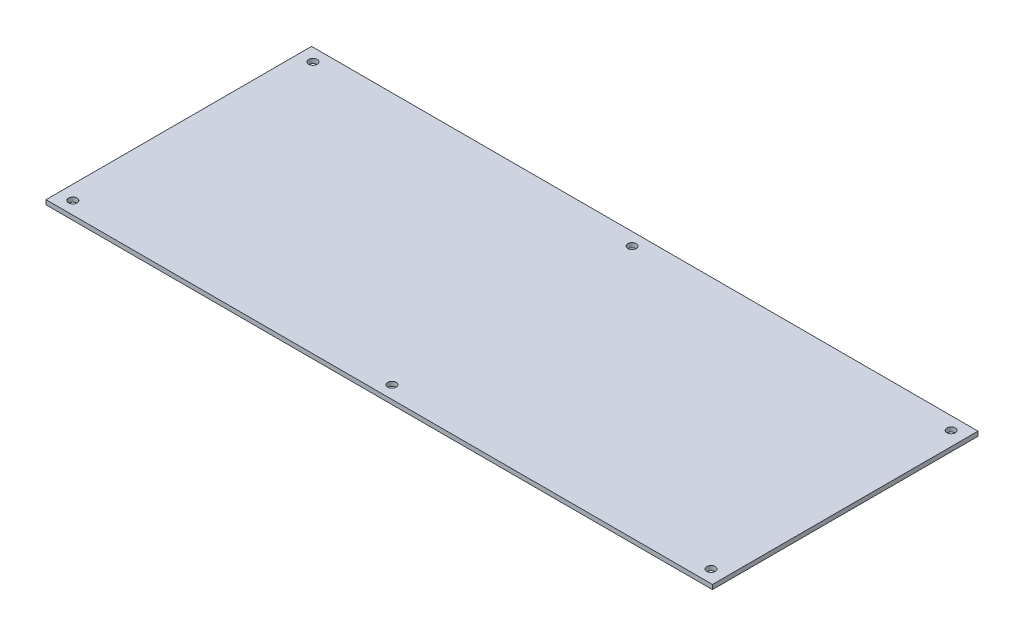
ISO-10303-21;
HEADER;
FILE_DESCRIPTION(('STEP AP214'),'2;1');
FILE_NAME('part.step','',(''),(''),'','','');
FILE_SCHEMA(('AUTOMOTIVE_DESIGN { 1 0 10303 214 1 1 1 1 }'));
ENDSEC;
DATA;
#1=APPLICATION_CONTEXT('core data for automotive mechanical design processes');
#2=APPLICATION_PROTOCOL_DEFINITION('international standard','automotive_design',2000,#1);
#3=PRODUCT_CONTEXT('',#1,'mechanical');
#4=PRODUCT('Part','Part','',(#3));
#5=PRODUCT_RELATED_PRODUCT_CATEGORY('part','',(#4));
#6=PRODUCT_DEFINITION_FORMATION('','',#4);
#7=PRODUCT_DEFINITION_CONTEXT('part definition',#1,'design');
#8=PRODUCT_DEFINITION('design','',#6,#7);
#9=PRODUCT_DEFINITION_SHAPE('','',#8);
#10=(LENGTH_UNIT() NAMED_UNIT(*) SI_UNIT(.MILLI.,.METRE.));
#11=(NAMED_UNIT(*) PLANE_ANGLE_UNIT() SI_UNIT($,.RADIAN.));
#12=(NAMED_UNIT(*) SI_UNIT($,.STERADIAN.) SOLID_ANGLE_UNIT());
#13=UNCERTAINTY_MEASURE_WITH_UNIT(LENGTH_MEASURE(1.E-05),#10,'distance_accuracy_value','');
#14=(GEOMETRIC_REPRESENTATION_CONTEXT(3) GLOBAL_UNCERTAINTY_ASSIGNED_CONTEXT((#13)) GLOBAL_UNIT_ASSIGNED_CONTEXT((#10,
#11,#12)) REPRESENTATION_CONTEXT('',''));
#15=CARTESIAN_POINT('',(0.,0.,0.));
#16=DIRECTION('',(0.,0.,1.));
#17=DIRECTION('',(1.,0.,0.));
#18=AXIS2_PLACEMENT_3D('',#15,#16,#17);
#19=CARTESIAN_POINT('',(235.915,-3.18,94.));
#20=DIRECTION('',(1.,0.,0.));
#21=DIRECTION('',(0.,0.,-1.));
#22=AXIS2_PLACEMENT_3D('',#19,#20,#21);
#23=PLANE('',#22);
#24=DIRECTION('',(0.,0.,-1.));
#25=VECTOR('',#24,1.);
#26=CARTESIAN_POINT('',(235.915,0.,94.));
#27=LINE('',#26,#25);
#28=CARTESIAN_POINT('',(235.915,0.,94.));
#29=VERTEX_POINT('',#28);
#30=CARTESIAN_POINT('',(235.915,0.,-94.));
#31=VERTEX_POINT('',#30);
#32=EDGE_CURVE('E105',#29,#31,#27,.T.);
#33=ORIENTED_EDGE('',*,*,#32,.F.);
#34=DIRECTION('',(0.,1.,0.));
#35=VECTOR('',#34,1.);
#36=CARTESIAN_POINT('',(235.915,-3.18,94.));
#37=LINE('',#36,#35);
#38=CARTESIAN_POINT('',(235.915,-3.18,94.));
#39=VERTEX_POINT('',#38);
#40=EDGE_CURVE('E11',#39,#29,#37,.T.);
#41=ORIENTED_EDGE('',*,*,#40,.F.);
#42=DIRECTION('',(0.,0.,-1.));
#43=VECTOR('',#42,1.);
#44=CARTESIAN_POINT('',(235.915,-3.18,94.));
#45=LINE('',#44,#43);
#46=CARTESIAN_POINT('',(235.915,-3.18,-94.));
#47=VERTEX_POINT('',#46);
#48=EDGE_CURVE('E98',#39,#47,#45,.T.);
#49=ORIENTED_EDGE('',*,*,#48,.T.);
#50=DIRECTION('',(0.,1.,0.));
#51=VECTOR('',#50,1.);
#52=CARTESIAN_POINT('',(235.915,-3.18,-94.));
#53=LINE('',#52,#51);
#54=EDGE_CURVE('E43',#47,#31,#53,.T.);
#55=ORIENTED_EDGE('',*,*,#54,.T.);
#56=EDGE_LOOP('',(#33,#41,#49,#55));
#57=FACE_BOUND('',#56,.T.);
#58=ADVANCED_FACE('F40',(#57),#23,.T.);
#59=CARTESIAN_POINT('',(-235.915,-3.18,94.));
#60=DIRECTION('',(0.,0.,1.));
#61=DIRECTION('',(1.,0.,0.));
#62=AXIS2_PLACEMENT_3D('',#59,#60,#61);
#63=PLANE('',#62);
#64=DIRECTION('',(1.,0.,0.));
#65=VECTOR('',#64,1.);
#66=CARTESIAN_POINT('',(-235.915,0.,94.));
#67=LINE('',#66,#65);
#68=CARTESIAN_POINT('',(-235.915,0.,94.));
#69=VERTEX_POINT('',#68);
#70=EDGE_CURVE('E100',#69,#29,#67,.T.);
#71=ORIENTED_EDGE('',*,*,#70,.F.);
#72=DIRECTION('',(0.,1.,0.));
#73=VECTOR('',#72,1.);
#74=CARTESIAN_POINT('',(-235.915,-3.18,94.));
#75=LINE('',#74,#73);
#76=CARTESIAN_POINT('',(-235.915,-3.18,94.));
#77=VERTEX_POINT('',#76);
#78=EDGE_CURVE('E49',#77,#69,#75,.T.);
#79=ORIENTED_EDGE('',*,*,#78,.F.);
#80=DIRECTION('',(1.,0.,0.));
#81=VECTOR('',#80,1.);
#82=CARTESIAN_POINT('',(-235.915,-3.18,94.));
#83=LINE('',#82,#81);
#84=EDGE_CURVE('E95',#77,#39,#83,.T.);
#85=ORIENTED_EDGE('',*,*,#84,.T.);
#86=ORIENTED_EDGE('',*,*,#40,.T.);
#87=EDGE_LOOP('',(#71,#79,#85,#86));
#88=FACE_BOUND('',#87,.T.);
#89=ADVANCED_FACE('F116',(#88),#63,.T.);
#90=CARTESIAN_POINT('',(-235.915,-3.18,94.));
#91=DIRECTION('',(-1.,0.,0.));
#92=DIRECTION('',(0.,0.,1.));
#93=AXIS2_PLACEMENT_3D('',#90,#91,#92);
#94=PLANE('',#93);
#95=DIRECTION('',(0.,0.,1.));
#96=VECTOR('',#95,1.);
#97=CARTESIAN_POINT('',(-235.915,0.,94.));
#98=LINE('',#97,#96);
#99=CARTESIAN_POINT('',(-235.915,0.,-94.));
#100=VERTEX_POINT('',#99);
#101=EDGE_CURVE('E90',#100,#69,#98,.T.);
#102=ORIENTED_EDGE('',*,*,#101,.F.);
#103=DIRECTION('',(0.,1.,0.));
#104=VECTOR('',#103,1.);
#105=CARTESIAN_POINT('',(-235.915,-3.18,-94.));
#106=LINE('',#105,#104);
#107=CARTESIAN_POINT('',(-235.915,-3.18,-94.));
#108=VERTEX_POINT('',#107);
#109=EDGE_CURVE('E85',#108,#100,#106,.T.);
#110=ORIENTED_EDGE('',*,*,#109,.F.);
#111=DIRECTION('',(0.,0.,1.));
#112=VECTOR('',#111,1.);
#113=CARTESIAN_POINT('',(-235.915,-3.18,94.));
#114=LINE('',#113,#112);
#115=EDGE_CURVE('E88',#108,#77,#114,.T.);
#116=ORIENTED_EDGE('',*,*,#115,.T.);
#117=ORIENTED_EDGE('',*,*,#78,.T.);
#118=EDGE_LOOP('',(#102,#110,#116,#117));
#119=FACE_BOUND('',#118,.T.);
#120=ADVANCED_FACE('F87',(#119),#94,.T.);
#121=CARTESIAN_POINT('',(-235.915,-3.18,-94.));
#122=DIRECTION('',(0.,0.,-1.));
#123=DIRECTION('',(-1.,0.,0.));
#124=AXIS2_PLACEMENT_3D('',#121,#122,#123);
#125=PLANE('',#124);
#126=DIRECTION('',(-1.,0.,0.));
#127=VECTOR('',#126,1.);
#128=CARTESIAN_POINT('',(-235.915,0.,-94.));
#129=LINE('',#128,#127);
#130=EDGE_CURVE('E108',#31,#100,#129,.T.);
#131=ORIENTED_EDGE('',*,*,#130,.F.);
#132=ORIENTED_EDGE('',*,*,#54,.F.);
#133=DIRECTION('',(-1.,0.,0.));
#134=VECTOR('',#133,1.);
#135=CARTESIAN_POINT('',(-235.915,-3.18,-94.));
#136=LINE('',#135,#134);
#137=EDGE_CURVE('E94',#47,#108,#136,.T.);
#138=ORIENTED_EDGE('',*,*,#137,.T.);
#139=ORIENTED_EDGE('',*,*,#109,.T.);
#140=EDGE_LOOP('',(#131,#132,#138,#139));
#141=FACE_BOUND('',#140,.T.);
#142=ADVANCED_FACE('F97',(#141),#125,.T.);
#143=CARTESIAN_POINT('',(0.,-3.18,0.));
#144=DIRECTION('',(0.,-1.,0.));
#145=DIRECTION('',(0.,0.,-1.));
#146=AXIS2_PLACEMENT_3D('',#143,#144,#145);
#147=PLANE('',#146);
#148=CARTESIAN_POINT('',(-225.915,-3.18,-85.));
#149=DIRECTION('',(0.,-1.,0.));
#150=DIRECTION('',(0.,0.,-1.));
#151=AXIS2_PLACEMENT_3D('',#148,#149,#150);
#152=CIRCLE('',#151,2.99999999999999);
#153=CARTESIAN_POINT('',(-225.915,-3.18,-88.));
#154=VERTEX_POINT('',#153);
#155=EDGE_CURVE('E109',#154,#154,#152,.T.);
#156=ORIENTED_EDGE('',*,*,#155,.F.);
#157=EDGE_LOOP('',(#156));
#158=FACE_BOUND('',#157,.T.);
#159=CARTESIAN_POINT('',(225.915,-3.18,-85.));
#160=DIRECTION('',(0.,-1.,0.));
#161=DIRECTION('',(0.,0.,-1.));
#162=AXIS2_PLACEMENT_3D('',#159,#160,#161);
#163=CIRCLE('',#162,2.99999999999999);
#164=CARTESIAN_POINT('',(225.915,-3.18,-88.));
#165=VERTEX_POINT('',#164);
#166=EDGE_CURVE('E198',#165,#165,#163,.T.);
#167=ORIENTED_EDGE('',*,*,#166,.F.);
#168=EDGE_LOOP('',(#167));
#169=FACE_BOUND('',#168,.T.);
#170=CARTESIAN_POINT('',(225.915,-3.18,85.));
#171=DIRECTION('',(0.,-1.,0.));
#172=DIRECTION('',(0.,0.,-1.));
#173=AXIS2_PLACEMENT_3D('',#170,#171,#172);
#174=CIRCLE('',#173,2.99999999999999);
#175=CARTESIAN_POINT('',(225.915,-3.18,82.));
#176=VERTEX_POINT('',#175);
#177=EDGE_CURVE('E195',#176,#176,#174,.T.);
#178=ORIENTED_EDGE('',*,*,#177,.F.);
#179=EDGE_LOOP('',(#178));
#180=FACE_BOUND('',#179,.T.);
#181=CARTESIAN_POINT('',(0.,-3.18,85.));
#182=DIRECTION('',(0.,-1.,0.));
#183=DIRECTION('',(0.,0.,-1.));
#184=AXIS2_PLACEMENT_3D('',#181,#182,#183);
#185=CIRCLE('',#184,3.);
#186=CARTESIAN_POINT('',(0.,-3.18,82.));
#187=VERTEX_POINT('',#186);
#188=EDGE_CURVE('E192',#187,#187,#185,.T.);
#189=ORIENTED_EDGE('',*,*,#188,.F.);
#190=EDGE_LOOP('',(#189));
#191=FACE_BOUND('',#190,.T.);
#192=CARTESIAN_POINT('',(0.,-3.18,-85.));
#193=DIRECTION('',(0.,-1.,0.));
#194=DIRECTION('',(0.,0.,-1.));
#195=AXIS2_PLACEMENT_3D('',#192,#193,#194);
#196=CIRCLE('',#195,3.);
#197=CARTESIAN_POINT('',(0.,-3.18,-88.));
#198=VERTEX_POINT('',#197);
#199=EDGE_CURVE('E166',#198,#198,#196,.T.);
#200=ORIENTED_EDGE('',*,*,#199,.F.);
#201=EDGE_LOOP('',(#200));
#202=FACE_BOUND('',#201,.T.);
#203=CARTESIAN_POINT('',(-225.915,-3.18,85.));
#204=DIRECTION('',(0.,-1.,0.));
#205=DIRECTION('',(0.,0.,-1.));
#206=AXIS2_PLACEMENT_3D('',#203,#204,#205);
#207=CIRCLE('',#206,2.99999999999999);
#208=CARTESIAN_POINT('',(-225.915,-3.18,82.));
#209=VERTEX_POINT('',#208);
#210=EDGE_CURVE('E188',#209,#209,#207,.T.);
#211=ORIENTED_EDGE('',*,*,#210,.F.);
#212=EDGE_LOOP('',(#211));
#213=FACE_BOUND('',#212,.T.);
#214=ORIENTED_EDGE('',*,*,#48,.F.);
#215=ORIENTED_EDGE('',*,*,#84,.F.);
#216=ORIENTED_EDGE('',*,*,#115,.F.);
#217=ORIENTED_EDGE('',*,*,#137,.F.);
#218=EDGE_LOOP('',(#214,#215,#216,#217));
#219=FACE_BOUND('',#218,.T.);
#220=ADVANCED_FACE('F93',(#158,#169,#180,#191,#202,#213,#219),#147,.T.);
#221=CARTESIAN_POINT('',(0.,0.,0.));
#222=DIRECTION('',(0.,-1.,0.));
#223=DIRECTION('',(0.,0.,-1.));
#224=AXIS2_PLACEMENT_3D('',#221,#222,#223);
#225=PLANE('',#224);
#226=CARTESIAN_POINT('',(-225.915,0.,-85.));
#227=DIRECTION('',(0.,-1.,0.));
#228=DIRECTION('',(0.,0.,1.));
#229=AXIS2_PLACEMENT_3D('',#226,#227,#228);
#230=CIRCLE('',#229,2.99999999999999);
#231=CARTESIAN_POINT('',(-225.915,0.,-88.));
#232=VERTEX_POINT('',#231);
#233=EDGE_CURVE('E177',#232,#232,#230,.T.);
#234=ORIENTED_EDGE('',*,*,#233,.T.);
#235=EDGE_LOOP('',(#234));
#236=FACE_BOUND('',#235,.T.);
#237=CARTESIAN_POINT('',(225.915,0.,-85.));
#238=DIRECTION('',(0.,-1.,0.));
#239=DIRECTION('',(0.,0.,-1.));
#240=AXIS2_PLACEMENT_3D('',#237,#238,#239);
#241=CIRCLE('',#240,2.99999999999999);
#242=CARTESIAN_POINT('',(225.915,0.,-88.));
#243=VERTEX_POINT('',#242);
#244=EDGE_CURVE('E181',#243,#243,#241,.T.);
#245=ORIENTED_EDGE('',*,*,#244,.T.);
#246=EDGE_LOOP('',(#245));
#247=FACE_BOUND('',#246,.T.);
#248=CARTESIAN_POINT('',(225.915,0.,85.));
#249=DIRECTION('',(0.,-1.,0.));
#250=DIRECTION('',(0.,0.,1.));
#251=AXIS2_PLACEMENT_3D('',#248,#249,#250);
#252=CIRCLE('',#251,2.99999999999999);
#253=CARTESIAN_POINT('',(225.915,0.,82.));
#254=VERTEX_POINT('',#253);
#255=EDGE_CURVE('E174',#254,#254,#252,.T.);
#256=ORIENTED_EDGE('',*,*,#255,.T.);
#257=EDGE_LOOP('',(#256));
#258=FACE_BOUND('',#257,.T.);
#259=CARTESIAN_POINT('',(0.,0.,85.));
#260=DIRECTION('',(0.,-1.,0.));
#261=DIRECTION('',(0.,0.,-1.));
#262=AXIS2_PLACEMENT_3D('',#259,#260,#261);
#263=CIRCLE('',#262,3.);
#264=CARTESIAN_POINT('',(0.,0.,82.));
#265=VERTEX_POINT('',#264);
#266=EDGE_CURVE('E171',#265,#265,#263,.T.);
#267=ORIENTED_EDGE('',*,*,#266,.T.);
#268=EDGE_LOOP('',(#267));
#269=FACE_BOUND('',#268,.T.);
#270=CARTESIAN_POINT('',(0.,0.,-85.));
#271=DIRECTION('',(0.,-1.,0.));
#272=DIRECTION('',(0.,0.,1.));
#273=AXIS2_PLACEMENT_3D('',#270,#271,#272);
#274=CIRCLE('',#273,3.);
#275=CARTESIAN_POINT('',(0.,0.,-88.));
#276=VERTEX_POINT('',#275);
#277=EDGE_CURVE('E169',#276,#276,#274,.T.);
#278=ORIENTED_EDGE('',*,*,#277,.T.);
#279=EDGE_LOOP('',(#278));
#280=FACE_BOUND('',#279,.T.);
#281=CARTESIAN_POINT('',(-225.915,0.,85.));
#282=DIRECTION('',(0.,-1.,0.));
#283=DIRECTION('',(0.,0.,-1.));
#284=AXIS2_PLACEMENT_3D('',#281,#282,#283);
#285=CIRCLE('',#284,2.99999999999999);
#286=CARTESIAN_POINT('',(-225.915,0.,82.));
#287=VERTEX_POINT('',#286);
#288=EDGE_CURVE('E180',#287,#287,#285,.T.);
#289=ORIENTED_EDGE('',*,*,#288,.T.);
#290=EDGE_LOOP('',(#289));
#291=FACE_BOUND('',#290,.T.);
#292=ORIENTED_EDGE('',*,*,#32,.T.);
#293=ORIENTED_EDGE('',*,*,#130,.T.);
#294=ORIENTED_EDGE('',*,*,#101,.T.);
#295=ORIENTED_EDGE('',*,*,#70,.T.);
#296=EDGE_LOOP('',(#292,#293,#294,#295));
#297=FACE_BOUND('',#296,.T.);
#298=ADVANCED_FACE('F115',(#236,#247,#258,#269,#280,#291,#297),#225,.F.);
#299=CARTESIAN_POINT('',(-225.915,0.,85.));
#300=DIRECTION('',(0.,-1.,0.));
#301=DIRECTION('',(0.,0.,-1.));
#302=AXIS2_PLACEMENT_3D('',#299,#300,#301);
#303=CYLINDRICAL_SURFACE('',#302,2.99999999999999);
#304=CARTESIAN_POINT('',(-225.915,-3.18,82.));
#305=CARTESIAN_POINT('',(-225.915,-3.146875,82.));
#306=CARTESIAN_POINT('',(-225.915,-3.11375,82.));
#307=CARTESIAN_POINT('',(-225.915,-3.0475,82.));
#308=CARTESIAN_POINT('',(-225.915,-3.014375,82.));
#309=CARTESIAN_POINT('',(-225.915,-2.948125,82.));
#310=CARTESIAN_POINT('',(-225.915,-2.915,82.));
#311=CARTESIAN_POINT('',(-225.915,-2.84875,82.));
#312=CARTESIAN_POINT('',(-225.915,-2.815625,82.));
#313=CARTESIAN_POINT('',(-225.915,-2.749375,82.));
#314=CARTESIAN_POINT('',(-225.915,-2.71625,82.));
#315=CARTESIAN_POINT('',(-225.915,-2.65,82.));
#316=CARTESIAN_POINT('',(-225.915,-2.616875,82.));
#317=CARTESIAN_POINT('',(-225.915,-2.550625,82.));
#318=CARTESIAN_POINT('',(-225.915,-2.5175,82.));
#319=CARTESIAN_POINT('',(-225.915,-2.45125,82.));
#320=CARTESIAN_POINT('',(-225.915,-2.418125,82.));
#321=CARTESIAN_POINT('',(-225.915,-2.351875,82.));
#322=CARTESIAN_POINT('',(-225.915,-2.31875,82.));
#323=CARTESIAN_POINT('',(-225.915,-2.2525,82.));
#324=CARTESIAN_POINT('',(-225.915,-2.219375,82.));
#325=CARTESIAN_POINT('',(-225.915,-2.153125,82.));
#326=CARTESIAN_POINT('',(-225.915,-2.12,82.));
#327=CARTESIAN_POINT('',(-225.915,-2.05375,82.));
#328=CARTESIAN_POINT('',(-225.915,-2.020625,82.));
#329=CARTESIAN_POINT('',(-225.915,-1.954375,82.));
#330=CARTESIAN_POINT('',(-225.915,-1.92125,82.));
#331=CARTESIAN_POINT('',(-225.915,-1.855,82.));
#332=CARTESIAN_POINT('',(-225.915,-1.821875,82.));
#333=CARTESIAN_POINT('',(-225.915,-1.755625,82.));
#334=CARTESIAN_POINT('',(-225.915,-1.7225,82.));
#335=CARTESIAN_POINT('',(-225.915,-1.65625,82.));
#336=CARTESIAN_POINT('',(-225.915,-1.623125,82.));
#337=CARTESIAN_POINT('',(-225.915,-1.556875,82.));
#338=CARTESIAN_POINT('',(-225.915,-1.52375,82.));
#339=CARTESIAN_POINT('',(-225.915,-1.4575,82.));
#340=CARTESIAN_POINT('',(-225.915,-1.424375,82.));
#341=CARTESIAN_POINT('',(-225.915,-1.358125,82.));
#342=CARTESIAN_POINT('',(-225.915,-1.325,82.));
#343=CARTESIAN_POINT('',(-225.915,-1.25875,82.));
#344=CARTESIAN_POINT('',(-225.915,-1.225625,82.));
#345=CARTESIAN_POINT('',(-225.915,-1.159375,82.));
#346=CARTESIAN_POINT('',(-225.915,-1.12625,82.));
#347=CARTESIAN_POINT('',(-225.915,-1.06,82.));
#348=CARTESIAN_POINT('',(-225.915,-1.026875,82.));
#349=CARTESIAN_POINT('',(-225.915,-0.960625,82.));
#350=CARTESIAN_POINT('',(-225.915,-0.9275,82.));
#351=CARTESIAN_POINT('',(-225.915,-0.86125,82.));
#352=CARTESIAN_POINT('',(-225.915,-0.828125,82.));
#353=CARTESIAN_POINT('',(-225.915,-0.761875,82.));
#354=CARTESIAN_POINT('',(-225.915,-0.72875,82.));
#355=CARTESIAN_POINT('',(-225.915,-0.6625,82.));
#356=CARTESIAN_POINT('',(-225.915,-0.629375,82.));
#357=CARTESIAN_POINT('',(-225.915,-0.563125,82.));
#358=CARTESIAN_POINT('',(-225.915,-0.53,82.));
#359=CARTESIAN_POINT('',(-225.915,-0.46375,82.));
#360=CARTESIAN_POINT('',(-225.915,-0.430625,82.));
#361=CARTESIAN_POINT('',(-225.915,-0.364375,82.));
#362=CARTESIAN_POINT('',(-225.915,-0.33125,82.));
#363=CARTESIAN_POINT('',(-225.915,-0.265,82.));
#364=CARTESIAN_POINT('',(-225.915,-0.231875,82.));
#365=CARTESIAN_POINT('',(-225.915,-0.165625,82.));
#366=CARTESIAN_POINT('',(-225.915,-0.1325,82.));
#367=CARTESIAN_POINT('',(-225.915,-0.06625,82.));
#368=CARTESIAN_POINT('',(-225.915,-0.033125,82.));
#369=CARTESIAN_POINT('',(-225.915,0.,82.));
#370=B_SPLINE_CURVE_WITH_KNOTS('',3,(#304,#305,#306,#307,#308,#309,#310,#311,#312,#313,#314,
#315,#316,#317,#318,#319,#320,#321,#322,#323,#324,#325,#326,#327,#328,#329,#330,#331,#332,#333,
#334,#335,#336,#337,#338,#339,#340,#341,#342,#343,#344,#345,#346,#347,#348,#349,#350,#351,#352,
#353,#354,#355,#356,#357,#358,#359,#360,#361,#362,#363,#364,#365,#366,#367,#368,#369),
.UNSPECIFIED.,.F.,.F.,(4,2,2,2,2,2,2,2,2,2,2,2,2,2,2,2,2,2,2,2,2,2,2,2,2,2,2,2,2,2,2,2,4),(0.,
0.0993750000000001,0.19875,0.298125,0.3975,0.496875,0.59625,0.695625,0.795,0.894375,0.99375,
1.093125,1.1925,1.291875,1.39125,1.490625,1.59,1.689375,1.78875,1.888125,1.9875,2.086875,
2.18625,2.285625,2.385,2.484375,2.58375,2.683125,2.7825,2.881875,2.98125,3.080625,3.18),.UNSPECIFIED.);
#371=EDGE_CURVE('BSEAM134',#209,#287,#370,.T.);
#372=ORIENTED_EDGE('',*,*,#210,.T.);
#373=ORIENTED_EDGE('',*,*,#288,.F.);
#374=ORIENTED_EDGE('',*,*,#371,.T.);
#375=ORIENTED_EDGE('',*,*,#371,.F.);
#376=EDGE_LOOP('',(#372,#374,#373,#375));
#377=FACE_BOUND('',#376,.T.);
#378=ADVANCED_FACE('F134',(#377),#303,.F.);
#379=CARTESIAN_POINT('',(0.,0.,-85.));
#380=DIRECTION('',(0.,-1.,0.));
#381=DIRECTION('',(0.,0.,-1.));
#382=AXIS2_PLACEMENT_3D('',#379,#380,#381);
#383=CYLINDRICAL_SURFACE('',#382,3.);
#384=CARTESIAN_POINT('',(0.,-3.18,-88.));
#385=CARTESIAN_POINT('',(0.,-3.146875,-88.));
#386=CARTESIAN_POINT('',(0.,-3.11375,-88.));
#387=CARTESIAN_POINT('',(0.,-3.0475,-88.));
#388=CARTESIAN_POINT('',(0.,-3.014375,-88.));
#389=CARTESIAN_POINT('',(0.,-2.948125,-88.));
#390=CARTESIAN_POINT('',(0.,-2.915,-88.));
#391=CARTESIAN_POINT('',(0.,-2.84875,-88.));
#392=CARTESIAN_POINT('',(0.,-2.815625,-88.));
#393=CARTESIAN_POINT('',(0.,-2.749375,-88.));
#394=CARTESIAN_POINT('',(0.,-2.71625,-88.));
#395=CARTESIAN_POINT('',(0.,-2.65,-88.));
#396=CARTESIAN_POINT('',(0.,-2.616875,-88.));
#397=CARTESIAN_POINT('',(0.,-2.550625,-88.));
#398=CARTESIAN_POINT('',(0.,-2.5175,-88.));
#399=CARTESIAN_POINT('',(0.,-2.45125,-88.));
#400=CARTESIAN_POINT('',(0.,-2.418125,-88.));
#401=CARTESIAN_POINT('',(0.,-2.351875,-88.));
#402=CARTESIAN_POINT('',(0.,-2.31875,-88.));
#403=CARTESIAN_POINT('',(0.,-2.2525,-88.));
#404=CARTESIAN_POINT('',(0.,-2.219375,-88.));
#405=CARTESIAN_POINT('',(0.,-2.153125,-88.));
#406=CARTESIAN_POINT('',(0.,-2.12,-88.));
#407=CARTESIAN_POINT('',(0.,-2.05375,-88.));
#408=CARTESIAN_POINT('',(0.,-2.020625,-88.));
#409=CARTESIAN_POINT('',(0.,-1.954375,-88.));
#410=CARTESIAN_POINT('',(0.,-1.92125,-88.));
#411=CARTESIAN_POINT('',(0.,-1.855,-88.));
#412=CARTESIAN_POINT('',(0.,-1.821875,-88.));
#413=CARTESIAN_POINT('',(0.,-1.755625,-88.));
#414=CARTESIAN_POINT('',(0.,-1.7225,-88.));
#415=CARTESIAN_POINT('',(0.,-1.65625,-88.));
#416=CARTESIAN_POINT('',(0.,-1.623125,-88.));
#417=CARTESIAN_POINT('',(0.,-1.556875,-88.));
#418=CARTESIAN_POINT('',(0.,-1.52375,-88.));
#419=CARTESIAN_POINT('',(0.,-1.4575,-88.));
#420=CARTESIAN_POINT('',(0.,-1.424375,-88.));
#421=CARTESIAN_POINT('',(0.,-1.358125,-88.));
#422=CARTESIAN_POINT('',(0.,-1.325,-88.));
#423=CARTESIAN_POINT('',(0.,-1.25875,-88.));
#424=CARTESIAN_POINT('',(0.,-1.225625,-88.));
#425=CARTESIAN_POINT('',(0.,-1.159375,-88.));
#426=CARTESIAN_POINT('',(0.,-1.12625,-88.));
#427=CARTESIAN_POINT('',(0.,-1.06,-88.));
#428=CARTESIAN_POINT('',(0.,-1.026875,-88.));
#429=CARTESIAN_POINT('',(0.,-0.960625,-88.));
#430=CARTESIAN_POINT('',(0.,-0.9275,-88.));
#431=CARTESIAN_POINT('',(0.,-0.86125,-88.));
#432=CARTESIAN_POINT('',(0.,-0.828125,-88.));
#433=CARTESIAN_POINT('',(0.,-0.761875,-88.));
#434=CARTESIAN_POINT('',(0.,-0.72875,-88.));
#435=CARTESIAN_POINT('',(0.,-0.6625,-88.));
#436=CARTESIAN_POINT('',(0.,-0.629375,-88.));
#437=CARTESIAN_POINT('',(0.,-0.563125,-88.));
#438=CARTESIAN_POINT('',(0.,-0.53,-88.));
#439=CARTESIAN_POINT('',(0.,-0.46375,-88.));
#440=CARTESIAN_POINT('',(0.,-0.430625,-88.));
#441=CARTESIAN_POINT('',(0.,-0.364375,-88.));
#442=CARTESIAN_POINT('',(0.,-0.33125,-88.));
#443=CARTESIAN_POINT('',(0.,-0.265,-88.));
#444=CARTESIAN_POINT('',(0.,-0.231875,-88.));
#445=CARTESIAN_POINT('',(0.,-0.165625,-88.));
#446=CARTESIAN_POINT('',(0.,-0.1325,-88.));
#447=CARTESIAN_POINT('',(0.,-0.06625,-88.));
#448=CARTESIAN_POINT('',(0.,-0.033125,-88.));
#449=CARTESIAN_POINT('',(0.,0.,-88.));
#450=B_SPLINE_CURVE_WITH_KNOTS('',3,(#384,#385,#386,#387,#388,#389,#390,#391,#392,#393,#394,
#395,#396,#397,#398,#399,#400,#401,#402,#403,#404,#405,#406,#407,#408,#409,#410,#411,#412,#413,
#414,#415,#416,#417,#418,#419,#420,#421,#422,#423,#424,#425,#426,#427,#428,#429,#430,#431,#432,
#433,#434,#435,#436,#437,#438,#439,#440,#441,#442,#443,#444,#445,#446,#447,#448,#449),
.UNSPECIFIED.,.F.,.F.,(4,2,2,2,2,2,2,2,2,2,2,2,2,2,2,2,2,2,2,2,2,2,2,2,2,2,2,2,2,2,2,2,4),(0.,
0.0993750000000001,0.19875,0.298125,0.3975,0.496875,0.59625,0.695625,0.795,0.894375,0.99375,
1.093125,1.1925,1.291875,1.39125,1.490625,1.59,1.689375,1.78875,1.888125,1.9875,2.086875,
2.18625,2.285625,2.385,2.484375,2.58375,2.683125,2.7825,2.881875,2.98125,3.080625,3.18),.UNSPECIFIED.);
#451=EDGE_CURVE('BSEAM141',#198,#276,#450,.T.);
#452=ORIENTED_EDGE('',*,*,#199,.T.);
#453=ORIENTED_EDGE('',*,*,#277,.F.);
#454=ORIENTED_EDGE('',*,*,#451,.T.);
#455=ORIENTED_EDGE('',*,*,#451,.F.);
#456=EDGE_LOOP('',(#452,#454,#453,#455));
#457=FACE_BOUND('',#456,.T.);
#458=ADVANCED_FACE('F141',(#457),#383,.F.);
#459=CARTESIAN_POINT('',(0.,0.,85.));
#460=DIRECTION('',(0.,-1.,0.));
#461=DIRECTION('',(0.,0.,-1.));
#462=AXIS2_PLACEMENT_3D('',#459,#460,#461);
#463=CYLINDRICAL_SURFACE('',#462,3.);
#464=CARTESIAN_POINT('',(0.,-3.18,82.));
#465=CARTESIAN_POINT('',(0.,-3.146875,82.));
#466=CARTESIAN_POINT('',(0.,-3.11375,82.));
#467=CARTESIAN_POINT('',(0.,-3.0475,82.));
#468=CARTESIAN_POINT('',(0.,-3.014375,82.));
#469=CARTESIAN_POINT('',(0.,-2.948125,82.));
#470=CARTESIAN_POINT('',(0.,-2.915,82.));
#471=CARTESIAN_POINT('',(0.,-2.84875,82.));
#472=CARTESIAN_POINT('',(0.,-2.815625,82.));
#473=CARTESIAN_POINT('',(0.,-2.749375,82.));
#474=CARTESIAN_POINT('',(0.,-2.71625,82.));
#475=CARTESIAN_POINT('',(0.,-2.65,82.));
#476=CARTESIAN_POINT('',(0.,-2.616875,82.));
#477=CARTESIAN_POINT('',(0.,-2.550625,82.));
#478=CARTESIAN_POINT('',(0.,-2.5175,82.));
#479=CARTESIAN_POINT('',(0.,-2.45125,82.));
#480=CARTESIAN_POINT('',(0.,-2.418125,82.));
#481=CARTESIAN_POINT('',(0.,-2.351875,82.));
#482=CARTESIAN_POINT('',(0.,-2.31875,82.));
#483=CARTESIAN_POINT('',(0.,-2.2525,82.));
#484=CARTESIAN_POINT('',(0.,-2.219375,82.));
#485=CARTESIAN_POINT('',(0.,-2.153125,82.));
#486=CARTESIAN_POINT('',(0.,-2.12,82.));
#487=CARTESIAN_POINT('',(0.,-2.05375,82.));
#488=CARTESIAN_POINT('',(0.,-2.020625,82.));
#489=CARTESIAN_POINT('',(0.,-1.954375,82.));
#490=CARTESIAN_POINT('',(0.,-1.92125,82.));
#491=CARTESIAN_POINT('',(0.,-1.855,82.));
#492=CARTESIAN_POINT('',(0.,-1.821875,82.));
#493=CARTESIAN_POINT('',(0.,-1.755625,82.));
#494=CARTESIAN_POINT('',(0.,-1.7225,82.));
#495=CARTESIAN_POINT('',(0.,-1.65625,82.));
#496=CARTESIAN_POINT('',(0.,-1.623125,82.));
#497=CARTESIAN_POINT('',(0.,-1.556875,82.));
#498=CARTESIAN_POINT('',(0.,-1.52375,82.));
#499=CARTESIAN_POINT('',(0.,-1.4575,82.));
#500=CARTESIAN_POINT('',(0.,-1.424375,82.));
#501=CARTESIAN_POINT('',(0.,-1.358125,82.));
#502=CARTESIAN_POINT('',(0.,-1.325,82.));
#503=CARTESIAN_POINT('',(0.,-1.25875,82.));
#504=CARTESIAN_POINT('',(0.,-1.225625,82.));
#505=CARTESIAN_POINT('',(0.,-1.159375,82.));
#506=CARTESIAN_POINT('',(0.,-1.12625,82.));
#507=CARTESIAN_POINT('',(0.,-1.06,82.));
#508=CARTESIAN_POINT('',(0.,-1.026875,82.));
#509=CARTESIAN_POINT('',(0.,-0.960625,82.));
#510=CARTESIAN_POINT('',(0.,-0.9275,82.));
#511=CARTESIAN_POINT('',(0.,-0.86125,82.));
#512=CARTESIAN_POINT('',(0.,-0.828125,82.));
#513=CARTESIAN_POINT('',(0.,-0.761875,82.));
#514=CARTESIAN_POINT('',(0.,-0.72875,82.));
#515=CARTESIAN_POINT('',(0.,-0.6625,82.));
#516=CARTESIAN_POINT('',(0.,-0.629375,82.));
#517=CARTESIAN_POINT('',(0.,-0.563125,82.));
#518=CARTESIAN_POINT('',(0.,-0.53,82.));
#519=CARTESIAN_POINT('',(0.,-0.46375,82.));
#520=CARTESIAN_POINT('',(0.,-0.430625,82.));
#521=CARTESIAN_POINT('',(0.,-0.364375,82.));
#522=CARTESIAN_POINT('',(0.,-0.33125,82.));
#523=CARTESIAN_POINT('',(0.,-0.265,82.));
#524=CARTESIAN_POINT('',(0.,-0.231875,82.));
#525=CARTESIAN_POINT('',(0.,-0.165625,82.));
#526=CARTESIAN_POINT('',(0.,-0.1325,82.));
#527=CARTESIAN_POINT('',(0.,-0.06625,82.));
#528=CARTESIAN_POINT('',(0.,-0.033125,82.));
#529=CARTESIAN_POINT('',(0.,0.,82.));
#530=B_SPLINE_CURVE_WITH_KNOTS('',3,(#464,#465,#466,#467,#468,#469,#470,#471,#472,#473,#474,
#475,#476,#477,#478,#479,#480,#481,#482,#483,#484,#485,#486,#487,#488,#489,#490,#491,#492,#493,
#494,#495,#496,#497,#498,#499,#500,#501,#502,#503,#504,#505,#506,#507,#508,#509,#510,#511,#512,
#513,#514,#515,#516,#517,#518,#519,#520,#521,#522,#523,#524,#525,#526,#527,#528,#529),
.UNSPECIFIED.,.F.,.F.,(4,2,2,2,2,2,2,2,2,2,2,2,2,2,2,2,2,2,2,2,2,2,2,2,2,2,2,2,2,2,2,2,4),(0.,
0.0993750000000001,0.19875,0.298125,0.3975,0.496875,0.59625,0.695625,0.795,0.894375,0.99375,
1.093125,1.1925,1.291875,1.39125,1.490625,1.59,1.689375,1.78875,1.888125,1.9875,2.086875,
2.18625,2.285625,2.385,2.484375,2.58375,2.683125,2.7825,2.881875,2.98125,3.080625,3.18),.UNSPECIFIED.);
#531=EDGE_CURVE('BSEAM143',#187,#265,#530,.T.);
#532=ORIENTED_EDGE('',*,*,#188,.T.);
#533=ORIENTED_EDGE('',*,*,#266,.F.);
#534=ORIENTED_EDGE('',*,*,#531,.T.);
#535=ORIENTED_EDGE('',*,*,#531,.F.);
#536=EDGE_LOOP('',(#532,#534,#533,#535));
#537=FACE_BOUND('',#536,.T.);
#538=ADVANCED_FACE('F143',(#537),#463,.F.);
#539=CARTESIAN_POINT('',(225.915,0.,85.));
#540=DIRECTION('',(0.,-1.,0.));
#541=DIRECTION('',(0.,0.,-1.));
#542=AXIS2_PLACEMENT_3D('',#539,#540,#541);
#543=CYLINDRICAL_SURFACE('',#542,2.99999999999999);
#544=CARTESIAN_POINT('',(225.915,-3.18,82.));
#545=CARTESIAN_POINT('',(225.915,-3.146875,82.));
#546=CARTESIAN_POINT('',(225.915,-3.11375,82.));
#547=CARTESIAN_POINT('',(225.915,-3.0475,82.));
#548=CARTESIAN_POINT('',(225.915,-3.014375,82.));
#549=CARTESIAN_POINT('',(225.915,-2.948125,82.));
#550=CARTESIAN_POINT('',(225.915,-2.915,82.));
#551=CARTESIAN_POINT('',(225.915,-2.84875,82.));
#552=CARTESIAN_POINT('',(225.915,-2.815625,82.));
#553=CARTESIAN_POINT('',(225.915,-2.749375,82.));
#554=CARTESIAN_POINT('',(225.915,-2.71625,82.));
#555=CARTESIAN_POINT('',(225.915,-2.65,82.));
#556=CARTESIAN_POINT('',(225.915,-2.616875,82.));
#557=CARTESIAN_POINT('',(225.915,-2.550625,82.));
#558=CARTESIAN_POINT('',(225.915,-2.5175,82.));
#559=CARTESIAN_POINT('',(225.915,-2.45125,82.));
#560=CARTESIAN_POINT('',(225.915,-2.418125,82.));
#561=CARTESIAN_POINT('',(225.915,-2.351875,82.));
#562=CARTESIAN_POINT('',(225.915,-2.31875,82.));
#563=CARTESIAN_POINT('',(225.915,-2.2525,82.));
#564=CARTESIAN_POINT('',(225.915,-2.219375,82.));
#565=CARTESIAN_POINT('',(225.915,-2.153125,82.));
#566=CARTESIAN_POINT('',(225.915,-2.12,82.));
#567=CARTESIAN_POINT('',(225.915,-2.05375,82.));
#568=CARTESIAN_POINT('',(225.915,-2.020625,82.));
#569=CARTESIAN_POINT('',(225.915,-1.954375,82.));
#570=CARTESIAN_POINT('',(225.915,-1.92125,82.));
#571=CARTESIAN_POINT('',(225.915,-1.855,82.));
#572=CARTESIAN_POINT('',(225.915,-1.821875,82.));
#573=CARTESIAN_POINT('',(225.915,-1.755625,82.));
#574=CARTESIAN_POINT('',(225.915,-1.7225,82.));
#575=CARTESIAN_POINT('',(225.915,-1.65625,82.));
#576=CARTESIAN_POINT('',(225.915,-1.623125,82.));
#577=CARTESIAN_POINT('',(225.915,-1.556875,82.));
#578=CARTESIAN_POINT('',(225.915,-1.52375,82.));
#579=CARTESIAN_POINT('',(225.915,-1.4575,82.));
#580=CARTESIAN_POINT('',(225.915,-1.424375,82.));
#581=CARTESIAN_POINT('',(225.915,-1.358125,82.));
#582=CARTESIAN_POINT('',(225.915,-1.325,82.));
#583=CARTESIAN_POINT('',(225.915,-1.25875,82.));
#584=CARTESIAN_POINT('',(225.915,-1.225625,82.));
#585=CARTESIAN_POINT('',(225.915,-1.159375,82.));
#586=CARTESIAN_POINT('',(225.915,-1.12625,82.));
#587=CARTESIAN_POINT('',(225.915,-1.06,82.));
#588=CARTESIAN_POINT('',(225.915,-1.026875,82.));
#589=CARTESIAN_POINT('',(225.915,-0.960625,82.));
#590=CARTESIAN_POINT('',(225.915,-0.9275,82.));
#591=CARTESIAN_POINT('',(225.915,-0.86125,82.));
#592=CARTESIAN_POINT('',(225.915,-0.828125,82.));
#593=CARTESIAN_POINT('',(225.915,-0.761875,82.));
#594=CARTESIAN_POINT('',(225.915,-0.72875,82.));
#595=CARTESIAN_POINT('',(225.915,-0.6625,82.));
#596=CARTESIAN_POINT('',(225.915,-0.629375,82.));
#597=CARTESIAN_POINT('',(225.915,-0.563125,82.));
#598=CARTESIAN_POINT('',(225.915,-0.53,82.));
#599=CARTESIAN_POINT('',(225.915,-0.46375,82.));
#600=CARTESIAN_POINT('',(225.915,-0.430625,82.));
#601=CARTESIAN_POINT('',(225.915,-0.364375,82.));
#602=CARTESIAN_POINT('',(225.915,-0.33125,82.));
#603=CARTESIAN_POINT('',(225.915,-0.265,82.));
#604=CARTESIAN_POINT('',(225.915,-0.231875,82.));
#605=CARTESIAN_POINT('',(225.915,-0.165625,82.));
#606=CARTESIAN_POINT('',(225.915,-0.1325,82.));
#607=CARTESIAN_POINT('',(225.915,-0.06625,82.));
#608=CARTESIAN_POINT('',(225.915,-0.033125,82.));
#609=CARTESIAN_POINT('',(225.915,0.,82.));
#610=B_SPLINE_CURVE_WITH_KNOTS('',3,(#544,#545,#546,#547,#548,#549,#550,#551,#552,#553,#554,
#555,#556,#557,#558,#559,#560,#561,#562,#563,#564,#565,#566,#567,#568,#569,#570,#571,#572,#573,
#574,#575,#576,#577,#578,#579,#580,#581,#582,#583,#584,#585,#586,#587,#588,#589,#590,#591,#592,
#593,#594,#595,#596,#597,#598,#599,#600,#601,#602,#603,#604,#605,#606,#607,#608,#609),
.UNSPECIFIED.,.F.,.F.,(4,2,2,2,2,2,2,2,2,2,2,2,2,2,2,2,2,2,2,2,2,2,2,2,2,2,2,2,2,2,2,2,4),(0.,
0.0993750000000001,0.19875,0.298125,0.3975,0.496875,0.59625,0.695625,0.795,0.894375,0.99375,
1.093125,1.1925,1.291875,1.39125,1.490625,1.59,1.689375,1.78875,1.888125,1.9875,2.086875,
2.18625,2.285625,2.385,2.484375,2.58375,2.683125,2.7825,2.881875,2.98125,3.080625,3.18),.UNSPECIFIED.);
#611=EDGE_CURVE('BSEAM146',#176,#254,#610,.T.);
#612=ORIENTED_EDGE('',*,*,#177,.T.);
#613=ORIENTED_EDGE('',*,*,#255,.F.);
#614=ORIENTED_EDGE('',*,*,#611,.T.);
#615=ORIENTED_EDGE('',*,*,#611,.F.);
#616=EDGE_LOOP('',(#612,#614,#613,#615));
#617=FACE_BOUND('',#616,.T.);
#618=ADVANCED_FACE('F146',(#617),#543,.F.);
#619=CARTESIAN_POINT('',(225.915,0.,-85.));
#620=DIRECTION('',(0.,-1.,0.));
#621=DIRECTION('',(0.,0.,-1.));
#622=AXIS2_PLACEMENT_3D('',#619,#620,#621);
#623=CYLINDRICAL_SURFACE('',#622,2.99999999999999);
#624=CARTESIAN_POINT('',(225.915,-3.18,-88.));
#625=CARTESIAN_POINT('',(225.915,-3.146875,-88.));
#626=CARTESIAN_POINT('',(225.915,-3.11375,-88.));
#627=CARTESIAN_POINT('',(225.915,-3.0475,-88.));
#628=CARTESIAN_POINT('',(225.915,-3.014375,-88.));
#629=CARTESIAN_POINT('',(225.915,-2.948125,-88.));
#630=CARTESIAN_POINT('',(225.915,-2.915,-88.));
#631=CARTESIAN_POINT('',(225.915,-2.84875,-88.));
#632=CARTESIAN_POINT('',(225.915,-2.815625,-88.));
#633=CARTESIAN_POINT('',(225.915,-2.749375,-88.));
#634=CARTESIAN_POINT('',(225.915,-2.71625,-88.));
#635=CARTESIAN_POINT('',(225.915,-2.65,-88.));
#636=CARTESIAN_POINT('',(225.915,-2.616875,-88.));
#637=CARTESIAN_POINT('',(225.915,-2.550625,-88.));
#638=CARTESIAN_POINT('',(225.915,-2.5175,-88.));
#639=CARTESIAN_POINT('',(225.915,-2.45125,-88.));
#640=CARTESIAN_POINT('',(225.915,-2.418125,-88.));
#641=CARTESIAN_POINT('',(225.915,-2.351875,-88.));
#642=CARTESIAN_POINT('',(225.915,-2.31875,-88.));
#643=CARTESIAN_POINT('',(225.915,-2.2525,-88.));
#644=CARTESIAN_POINT('',(225.915,-2.219375,-88.));
#645=CARTESIAN_POINT('',(225.915,-2.153125,-88.));
#646=CARTESIAN_POINT('',(225.915,-2.12,-88.));
#647=CARTESIAN_POINT('',(225.915,-2.05375,-88.));
#648=CARTESIAN_POINT('',(225.915,-2.020625,-88.));
#649=CARTESIAN_POINT('',(225.915,-1.954375,-88.));
#650=CARTESIAN_POINT('',(225.915,-1.92125,-88.));
#651=CARTESIAN_POINT('',(225.915,-1.855,-88.));
#652=CARTESIAN_POINT('',(225.915,-1.821875,-88.));
#653=CARTESIAN_POINT('',(225.915,-1.755625,-88.));
#654=CARTESIAN_POINT('',(225.915,-1.7225,-88.));
#655=CARTESIAN_POINT('',(225.915,-1.65625,-88.));
#656=CARTESIAN_POINT('',(225.915,-1.623125,-88.));
#657=CARTESIAN_POINT('',(225.915,-1.556875,-88.));
#658=CARTESIAN_POINT('',(225.915,-1.52375,-88.));
#659=CARTESIAN_POINT('',(225.915,-1.4575,-88.));
#660=CARTESIAN_POINT('',(225.915,-1.424375,-88.));
#661=CARTESIAN_POINT('',(225.915,-1.358125,-88.));
#662=CARTESIAN_POINT('',(225.915,-1.325,-88.));
#663=CARTESIAN_POINT('',(225.915,-1.25875,-88.));
#664=CARTESIAN_POINT('',(225.915,-1.225625,-88.));
#665=CARTESIAN_POINT('',(225.915,-1.159375,-88.));
#666=CARTESIAN_POINT('',(225.915,-1.12625,-88.));
#667=CARTESIAN_POINT('',(225.915,-1.06,-88.));
#668=CARTESIAN_POINT('',(225.915,-1.026875,-88.));
#669=CARTESIAN_POINT('',(225.915,-0.960625,-88.));
#670=CARTESIAN_POINT('',(225.915,-0.9275,-88.));
#671=CARTESIAN_POINT('',(225.915,-0.86125,-88.));
#672=CARTESIAN_POINT('',(225.915,-0.828125,-88.));
#673=CARTESIAN_POINT('',(225.915,-0.761875,-88.));
#674=CARTESIAN_POINT('',(225.915,-0.72875,-88.));
#675=CARTESIAN_POINT('',(225.915,-0.6625,-88.));
#676=CARTESIAN_POINT('',(225.915,-0.629375,-88.));
#677=CARTESIAN_POINT('',(225.915,-0.563125,-88.));
#678=CARTESIAN_POINT('',(225.915,-0.53,-88.));
#679=CARTESIAN_POINT('',(225.915,-0.46375,-88.));
#680=CARTESIAN_POINT('',(225.915,-0.430625,-88.));
#681=CARTESIAN_POINT('',(225.915,-0.364375,-88.));
#682=CARTESIAN_POINT('',(225.915,-0.33125,-88.));
#683=CARTESIAN_POINT('',(225.915,-0.265,-88.));
#684=CARTESIAN_POINT('',(225.915,-0.231875,-88.));
#685=CARTESIAN_POINT('',(225.915,-0.165625,-88.));
#686=CARTESIAN_POINT('',(225.915,-0.1325,-88.));
#687=CARTESIAN_POINT('',(225.915,-0.06625,-88.));
#688=CARTESIAN_POINT('',(225.915,-0.033125,-88.));
#689=CARTESIAN_POINT('',(225.915,0.,-88.));
#690=B_SPLINE_CURVE_WITH_KNOTS('',3,(#624,#625,#626,#627,#628,#629,#630,#631,#632,#633,#634,
#635,#636,#637,#638,#639,#640,#641,#642,#643,#644,#645,#646,#647,#648,#649,#650,#651,#652,#653,
#654,#655,#656,#657,#658,#659,#660,#661,#662,#663,#664,#665,#666,#667,#668,#669,#670,#671,#672,
#673,#674,#675,#676,#677,#678,#679,#680,#681,#682,#683,#684,#685,#686,#687,#688,#689),
.UNSPECIFIED.,.F.,.F.,(4,2,2,2,2,2,2,2,2,2,2,2,2,2,2,2,2,2,2,2,2,2,2,2,2,2,2,2,2,2,2,2,4),(0.,
0.0993750000000001,0.19875,0.298125,0.3975,0.496875,0.59625,0.695625,0.795,0.894375,0.99375,
1.093125,1.1925,1.291875,1.39125,1.490625,1.59,1.689375,1.78875,1.888125,1.9875,2.086875,
2.18625,2.285625,2.385,2.484375,2.58375,2.683125,2.7825,2.881875,2.98125,3.080625,3.18),.UNSPECIFIED.);
#691=EDGE_CURVE('BSEAM150',#165,#243,#690,.T.);
#692=ORIENTED_EDGE('',*,*,#166,.T.);
#693=ORIENTED_EDGE('',*,*,#244,.F.);
#694=ORIENTED_EDGE('',*,*,#691,.T.);
#695=ORIENTED_EDGE('',*,*,#691,.F.);
#696=EDGE_LOOP('',(#692,#694,#693,#695));
#697=FACE_BOUND('',#696,.T.);
#698=ADVANCED_FACE('F150',(#697),#623,.F.);
#699=CARTESIAN_POINT('',(-225.915,0.,-85.));
#700=DIRECTION('',(0.,-1.,0.));
#701=DIRECTION('',(0.,0.,-1.));
#702=AXIS2_PLACEMENT_3D('',#699,#700,#701);
#703=CYLINDRICAL_SURFACE('',#702,2.99999999999999);
#704=CARTESIAN_POINT('',(-225.915,-3.18,-88.));
#705=CARTESIAN_POINT('',(-225.915,-3.146875,-88.));
#706=CARTESIAN_POINT('',(-225.915,-3.11375,-88.));
#707=CARTESIAN_POINT('',(-225.915,-3.0475,-88.));
#708=CARTESIAN_POINT('',(-225.915,-3.014375,-88.));
#709=CARTESIAN_POINT('',(-225.915,-2.948125,-88.));
#710=CARTESIAN_POINT('',(-225.915,-2.915,-88.));
#711=CARTESIAN_POINT('',(-225.915,-2.84875,-88.));
#712=CARTESIAN_POINT('',(-225.915,-2.815625,-88.));
#713=CARTESIAN_POINT('',(-225.915,-2.749375,-88.));
#714=CARTESIAN_POINT('',(-225.915,-2.71625,-88.));
#715=CARTESIAN_POINT('',(-225.915,-2.65,-88.));
#716=CARTESIAN_POINT('',(-225.915,-2.616875,-88.));
#717=CARTESIAN_POINT('',(-225.915,-2.550625,-88.));
#718=CARTESIAN_POINT('',(-225.915,-2.5175,-88.));
#719=CARTESIAN_POINT('',(-225.915,-2.45125,-88.));
#720=CARTESIAN_POINT('',(-225.915,-2.418125,-88.));
#721=CARTESIAN_POINT('',(-225.915,-2.351875,-88.));
#722=CARTESIAN_POINT('',(-225.915,-2.31875,-88.));
#723=CARTESIAN_POINT('',(-225.915,-2.2525,-88.));
#724=CARTESIAN_POINT('',(-225.915,-2.219375,-88.));
#725=CARTESIAN_POINT('',(-225.915,-2.153125,-88.));
#726=CARTESIAN_POINT('',(-225.915,-2.12,-88.));
#727=CARTESIAN_POINT('',(-225.915,-2.05375,-88.));
#728=CARTESIAN_POINT('',(-225.915,-2.020625,-88.));
#729=CARTESIAN_POINT('',(-225.915,-1.954375,-88.));
#730=CARTESIAN_POINT('',(-225.915,-1.92125,-88.));
#731=CARTESIAN_POINT('',(-225.915,-1.855,-88.));
#732=CARTESIAN_POINT('',(-225.915,-1.821875,-88.));
#733=CARTESIAN_POINT('',(-225.915,-1.755625,-88.));
#734=CARTESIAN_POINT('',(-225.915,-1.7225,-88.));
#735=CARTESIAN_POINT('',(-225.915,-1.65625,-88.));
#736=CARTESIAN_POINT('',(-225.915,-1.623125,-88.));
#737=CARTESIAN_POINT('',(-225.915,-1.556875,-88.));
#738=CARTESIAN_POINT('',(-225.915,-1.52375,-88.));
#739=CARTESIAN_POINT('',(-225.915,-1.4575,-88.));
#740=CARTESIAN_POINT('',(-225.915,-1.424375,-88.));
#741=CARTESIAN_POINT('',(-225.915,-1.358125,-88.));
#742=CARTESIAN_POINT('',(-225.915,-1.325,-88.));
#743=CARTESIAN_POINT('',(-225.915,-1.25875,-88.));
#744=CARTESIAN_POINT('',(-225.915,-1.225625,-88.));
#745=CARTESIAN_POINT('',(-225.915,-1.159375,-88.));
#746=CARTESIAN_POINT('',(-225.915,-1.12625,-88.));
#747=CARTESIAN_POINT('',(-225.915,-1.06,-88.));
#748=CARTESIAN_POINT('',(-225.915,-1.026875,-88.));
#749=CARTESIAN_POINT('',(-225.915,-0.960625,-88.));
#750=CARTESIAN_POINT('',(-225.915,-0.9275,-88.));
#751=CARTESIAN_POINT('',(-225.915,-0.86125,-88.));
#752=CARTESIAN_POINT('',(-225.915,-0.828125,-88.));
#753=CARTESIAN_POINT('',(-225.915,-0.761875,-88.));
#754=CARTESIAN_POINT('',(-225.915,-0.72875,-88.));
#755=CARTESIAN_POINT('',(-225.915,-0.6625,-88.));
#756=CARTESIAN_POINT('',(-225.915,-0.629375,-88.));
#757=CARTESIAN_POINT('',(-225.915,-0.563125,-88.));
#758=CARTESIAN_POINT('',(-225.915,-0.53,-88.));
#759=CARTESIAN_POINT('',(-225.915,-0.46375,-88.));
#760=CARTESIAN_POINT('',(-225.915,-0.430625,-88.));
#761=CARTESIAN_POINT('',(-225.915,-0.364375,-88.));
#762=CARTESIAN_POINT('',(-225.915,-0.33125,-88.));
#763=CARTESIAN_POINT('',(-225.915,-0.265,-88.));
#764=CARTESIAN_POINT('',(-225.915,-0.231875,-88.));
#765=CARTESIAN_POINT('',(-225.915,-0.165625,-88.));
#766=CARTESIAN_POINT('',(-225.915,-0.1325,-88.));
#767=CARTESIAN_POINT('',(-225.915,-0.06625,-88.));
#768=CARTESIAN_POINT('',(-225.915,-0.033125,-88.));
#769=CARTESIAN_POINT('',(-225.915,0.,-88.));
#770=B_SPLINE_CURVE_WITH_KNOTS('',3,(#704,#705,#706,#707,#708,#709,#710,#711,#712,#713,#714,
#715,#716,#717,#718,#719,#720,#721,#722,#723,#724,#725,#726,#727,#728,#729,#730,#731,#732,#733,
#734,#735,#736,#737,#738,#739,#740,#741,#742,#743,#744,#745,#746,#747,#748,#749,#750,#751,#752,
#753,#754,#755,#756,#757,#758,#759,#760,#761,#762,#763,#764,#765,#766,#767,#768,#769),
.UNSPECIFIED.,.F.,.F.,(4,2,2,2,2,2,2,2,2,2,2,2,2,2,2,2,2,2,2,2,2,2,2,2,2,2,2,2,2,2,2,2,4),(0.,
0.0993750000000001,0.19875,0.298125,0.3975,0.496875,0.59625,0.695625,0.795,0.894375,0.99375,
1.093125,1.1925,1.291875,1.39125,1.490625,1.59,1.689375,1.78875,1.888125,1.9875,2.086875,
2.18625,2.285625,2.385,2.484375,2.58375,2.683125,2.7825,2.881875,2.98125,3.080625,3.18),.UNSPECIFIED.);
#771=EDGE_CURVE('BSEAM154',#154,#232,#770,.T.);
#772=ORIENTED_EDGE('',*,*,#155,.T.);
#773=ORIENTED_EDGE('',*,*,#233,.F.);
#774=ORIENTED_EDGE('',*,*,#771,.T.);
#775=ORIENTED_EDGE('',*,*,#771,.F.);
#776=EDGE_LOOP('',(#772,#774,#773,#775));
#777=FACE_BOUND('',#776,.T.);
#778=ADVANCED_FACE('F154',(#777),#703,.F.);
#779=CLOSED_SHELL('',(#58,#89,#120,#142,#220,#298,#378,#458,#538,#618,#698,#778));
#780=MANIFOLD_SOLID_BREP('B2',#779);
#781=ADVANCED_BREP_SHAPE_REPRESENTATION('',(#18,#780),#14);
#782=SHAPE_DEFINITION_REPRESENTATION(#9,#781);
ENDSEC;
END-ISO-10303-21;
